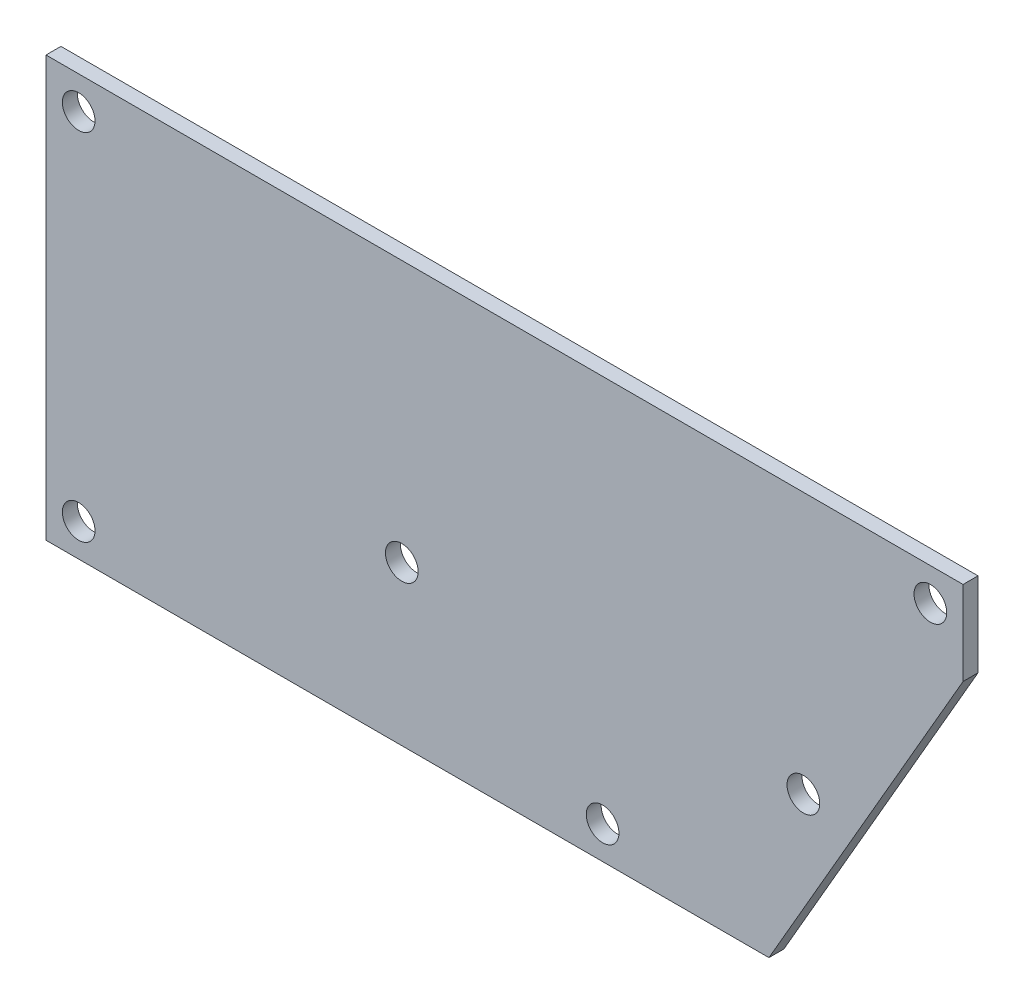
ISO-10303-21;
HEADER;
FILE_DESCRIPTION(('STEP AP214'),'2;1');
FILE_NAME('part.step','',(''),(''),'','','');
FILE_SCHEMA(('AUTOMOTIVE_DESIGN { 1 0 10303 214 1 1 1 1 }'));
ENDSEC;
DATA;
#1=APPLICATION_CONTEXT('core data for automotive mechanical design processes');
#2=APPLICATION_PROTOCOL_DEFINITION('international standard','automotive_design',2000,#1);
#3=PRODUCT_CONTEXT('',#1,'mechanical');
#4=PRODUCT('Part','Part','',(#3));
#5=PRODUCT_RELATED_PRODUCT_CATEGORY('part','',(#4));
#6=PRODUCT_DEFINITION_FORMATION('','',#4);
#7=PRODUCT_DEFINITION_CONTEXT('part definition',#1,'design');
#8=PRODUCT_DEFINITION('design','',#6,#7);
#9=PRODUCT_DEFINITION_SHAPE('','',#8);
#10=(LENGTH_UNIT() NAMED_UNIT(*) SI_UNIT(.MILLI.,.METRE.));
#11=(NAMED_UNIT(*) PLANE_ANGLE_UNIT() SI_UNIT($,.RADIAN.));
#12=(NAMED_UNIT(*) SI_UNIT($,.STERADIAN.) SOLID_ANGLE_UNIT());
#13=UNCERTAINTY_MEASURE_WITH_UNIT(LENGTH_MEASURE(1.E-05),#10,'distance_accuracy_value','');
#14=(GEOMETRIC_REPRESENTATION_CONTEXT(3) GLOBAL_UNCERTAINTY_ASSIGNED_CONTEXT((#13)) GLOBAL_UNIT_ASSIGNED_CONTEXT((#10,
#11,#12)) REPRESENTATION_CONTEXT('',''));
#15=CARTESIAN_POINT('',(0.,0.,0.));
#16=DIRECTION('',(0.,0.,1.));
#17=DIRECTION('',(1.,0.,0.));
#18=AXIS2_PLACEMENT_3D('',#15,#16,#17);
#19=CARTESIAN_POINT('',(0.,0.,1.6));
#20=DIRECTION('',(0.,0.,-1.));
#21=DIRECTION('',(-1.,0.,0.));
#22=AXIS2_PLACEMENT_3D('',#19,#20,#21);
#23=PLANE('',#22);
#24=DIRECTION('',(-1.,0.,0.));
#25=VECTOR('',#24,1.);
#26=CARTESIAN_POINT('',(-49.0980000000001,21.,1.6));
#27=LINE('',#26,#25);
#28=CARTESIAN_POINT('',(49.0980000000001,21.,1.6));
#29=VERTEX_POINT('',#28);
#30=CARTESIAN_POINT('',(-49.0980000000001,21.,1.6));
#31=VERTEX_POINT('',#30);
#32=EDGE_CURVE('E117',#29,#31,#27,.T.);
#33=ORIENTED_EDGE('',*,*,#32,.T.);
#34=DIRECTION('',(0.,-1.,0.));
#35=VECTOR('',#34,1.);
#36=CARTESIAN_POINT('',(-49.0980000000001,15.,1.6));
#37=LINE('',#36,#35);
#38=CARTESIAN_POINT('',(-49.0980000000001,-24.,1.6));
#39=VERTEX_POINT('',#38);
#40=EDGE_CURVE('E84',#31,#39,#37,.T.);
#41=ORIENTED_EDGE('',*,*,#40,.T.);
#42=DIRECTION('',(1.,0.,0.));
#43=VECTOR('',#42,1.);
#44=CARTESIAN_POINT('',(-49.0980000000001,-24.,1.6));
#45=LINE('',#44,#43);
#46=CARTESIAN_POINT('',(28.3133903091733,-24.,1.6));
#47=VERTEX_POINT('',#46);
#48=EDGE_CURVE('E88',#39,#47,#45,.T.);
#49=ORIENTED_EDGE('',*,*,#48,.T.);
#50=DIRECTION('',(0.500000000000004,0.866025403784436,0.));
#51=VECTOR('',#50,1.);
#52=CARTESIAN_POINT('',(49.0980000000001,12.,1.6));
#53=LINE('',#52,#51);
#54=CARTESIAN_POINT('',(49.0980000000001,12.,1.6));
#55=VERTEX_POINT('',#54);
#56=EDGE_CURVE('E92',#47,#55,#53,.T.);
#57=ORIENTED_EDGE('',*,*,#56,.T.);
#58=DIRECTION('',(0.,1.,0.));
#59=VECTOR('',#58,1.);
#60=CARTESIAN_POINT('',(49.0980000000001,21.,1.6));
#61=LINE('',#60,#59);
#62=EDGE_CURVE('E50',#55,#29,#61,.T.);
#63=ORIENTED_EDGE('',*,*,#62,.T.);
#64=EDGE_LOOP('',(#33,#41,#49,#57,#63));
#65=FACE_BOUND('',#64,.T.);
#66=CARTESIAN_POINT('',(10.5,-20.5,1.6));
#67=DIRECTION('',(0.,0.,1.));
#68=DIRECTION('',(1.,0.,0.));
#69=AXIS2_PLACEMENT_3D('',#66,#67,#68);
#70=CIRCLE('',#69,1.75);
#71=CARTESIAN_POINT('',(12.25,-20.5,1.6));
#72=VERTEX_POINT('',#71);
#73=EDGE_CURVE('E112',#72,#72,#70,.T.);
#74=ORIENTED_EDGE('',*,*,#73,.F.);
#75=EDGE_LOOP('',(#74));
#76=FACE_BOUND('',#75,.T.);
#77=CARTESIAN_POINT('',(32.,-7.,1.6));
#78=DIRECTION('',(0.,0.,1.));
#79=DIRECTION('',(1.,0.,0.));
#80=AXIS2_PLACEMENT_3D('',#77,#78,#79);
#81=CIRCLE('',#80,1.75000000000001);
#82=CARTESIAN_POINT('',(33.75,-7.,1.6));
#83=VERTEX_POINT('',#82);
#84=EDGE_CURVE('E196',#83,#83,#81,.T.);
#85=ORIENTED_EDGE('',*,*,#84,.F.);
#86=EDGE_LOOP('',(#85));
#87=FACE_BOUND('',#86,.T.);
#88=CARTESIAN_POINT('',(-11.,-7.,1.6));
#89=DIRECTION('',(0.,0.,1.));
#90=DIRECTION('',(1.,0.,0.));
#91=AXIS2_PLACEMENT_3D('',#88,#89,#90);
#92=CIRCLE('',#91,1.75);
#93=CARTESIAN_POINT('',(-9.25,-7.,1.6));
#94=VERTEX_POINT('',#93);
#95=EDGE_CURVE('E190',#94,#94,#92,.T.);
#96=ORIENTED_EDGE('',*,*,#95,.F.);
#97=EDGE_LOOP('',(#96));
#98=FACE_BOUND('',#97,.T.);
#99=CARTESIAN_POINT('',(45.5980000000001,17.5,1.6));
#100=DIRECTION('',(0.,0.,1.));
#101=DIRECTION('',(1.,0.,0.));
#102=AXIS2_PLACEMENT_3D('',#99,#100,#101);
#103=CIRCLE('',#102,1.75);
#104=CARTESIAN_POINT('',(47.3480000000001,17.5,1.6));
#105=VERTEX_POINT('',#104);
#106=EDGE_CURVE('E184',#105,#105,#103,.T.);
#107=ORIENTED_EDGE('',*,*,#106,.F.);
#108=EDGE_LOOP('',(#107));
#109=FACE_BOUND('',#108,.T.);
#110=CARTESIAN_POINT('',(-45.5980000000001,17.5,1.6));
#111=DIRECTION('',(0.,0.,1.));
#112=DIRECTION('',(1.,0.,0.));
#113=AXIS2_PLACEMENT_3D('',#110,#111,#112);
#114=CIRCLE('',#113,1.75);
#115=CARTESIAN_POINT('',(-43.8480000000001,17.5,1.6));
#116=VERTEX_POINT('',#115);
#117=EDGE_CURVE('E178',#116,#116,#114,.T.);
#118=ORIENTED_EDGE('',*,*,#117,.F.);
#119=EDGE_LOOP('',(#118));
#120=FACE_BOUND('',#119,.T.);
#121=CARTESIAN_POINT('',(-45.5980000000001,-20.5,1.6));
#122=DIRECTION('',(0.,0.,1.));
#123=DIRECTION('',(1.,0.,0.));
#124=AXIS2_PLACEMENT_3D('',#121,#122,#123);
#125=CIRCLE('',#124,1.75);
#126=CARTESIAN_POINT('',(-43.8480000000001,-20.5,1.6));
#127=VERTEX_POINT('',#126);
#128=EDGE_CURVE('E169',#127,#127,#125,.T.);
#129=ORIENTED_EDGE('',*,*,#128,.F.);
#130=EDGE_LOOP('',(#129));
#131=FACE_BOUND('',#130,.T.);
#132=ADVANCED_FACE('F33',(#65,#76,#87,#98,#109,#120,#131),#23,.F.);
#133=CARTESIAN_POINT('',(0.,0.,0.));
#134=DIRECTION('',(0.,0.,-1.));
#135=DIRECTION('',(-1.,0.,0.));
#136=AXIS2_PLACEMENT_3D('',#133,#134,#135);
#137=PLANE('',#136);
#138=CARTESIAN_POINT('',(-45.5980000000001,17.5,0.));
#139=DIRECTION('',(0.,0.,1.));
#140=DIRECTION('',(1.,0.,0.));
#141=AXIS2_PLACEMENT_3D('',#138,#139,#140);
#142=CIRCLE('',#141,1.75);
#143=CARTESIAN_POINT('',(-43.8480000000001,17.5,0.));
#144=VERTEX_POINT('',#143);
#145=EDGE_CURVE('E175',#144,#144,#142,.T.);
#146=ORIENTED_EDGE('',*,*,#145,.T.);
#147=EDGE_LOOP('',(#146));
#148=FACE_BOUND('',#147,.T.);
#149=CARTESIAN_POINT('',(-11.,-7.,0.));
#150=DIRECTION('',(0.,0.,1.));
#151=DIRECTION('',(1.,0.,0.));
#152=AXIS2_PLACEMENT_3D('',#149,#150,#151);
#153=CIRCLE('',#152,1.75);
#154=CARTESIAN_POINT('',(-9.25,-7.,0.));
#155=VERTEX_POINT('',#154);
#156=EDGE_CURVE('E187',#155,#155,#153,.T.);
#157=ORIENTED_EDGE('',*,*,#156,.T.);
#158=EDGE_LOOP('',(#157));
#159=FACE_BOUND('',#158,.T.);
#160=CARTESIAN_POINT('',(10.5,-20.5,0.));
#161=DIRECTION('',(0.,0.,1.));
#162=DIRECTION('',(1.,0.,0.));
#163=AXIS2_PLACEMENT_3D('',#160,#161,#162);
#164=CIRCLE('',#163,1.75);
#165=CARTESIAN_POINT('',(12.25,-20.5,0.));
#166=VERTEX_POINT('',#165);
#167=EDGE_CURVE('E199',#166,#166,#164,.T.);
#168=ORIENTED_EDGE('',*,*,#167,.T.);
#169=EDGE_LOOP('',(#168));
#170=FACE_BOUND('',#169,.T.);
#171=DIRECTION('',(-1.,0.,0.));
#172=VECTOR('',#171,1.);
#173=CARTESIAN_POINT('',(-49.0980000000001,21.,0.));
#174=LINE('',#173,#172);
#175=CARTESIAN_POINT('',(49.0980000000001,21.,0.));
#176=VERTEX_POINT('',#175);
#177=CARTESIAN_POINT('',(-49.0980000000001,21.,0.));
#178=VERTEX_POINT('',#177);
#179=EDGE_CURVE('E108',#176,#178,#174,.T.);
#180=ORIENTED_EDGE('',*,*,#179,.F.);
#181=DIRECTION('',(0.,1.,0.));
#182=VECTOR('',#181,1.);
#183=CARTESIAN_POINT('',(49.0980000000001,21.,0.));
#184=LINE('',#183,#182);
#185=CARTESIAN_POINT('',(49.0980000000001,12.,0.));
#186=VERTEX_POINT('',#185);
#187=EDGE_CURVE('E76',#186,#176,#184,.T.);
#188=ORIENTED_EDGE('',*,*,#187,.F.);
#189=DIRECTION('',(0.500000000000004,0.866025403784436,0.));
#190=VECTOR('',#189,1.);
#191=CARTESIAN_POINT('',(49.0980000000001,12.,0.));
#192=LINE('',#191,#190);
#193=CARTESIAN_POINT('',(28.3133903091733,-24.,0.));
#194=VERTEX_POINT('',#193);
#195=EDGE_CURVE('E70',#194,#186,#192,.T.);
#196=ORIENTED_EDGE('',*,*,#195,.F.);
#197=DIRECTION('',(1.,0.,0.));
#198=VECTOR('',#197,1.);
#199=CARTESIAN_POINT('',(-49.0980000000001,-24.,0.));
#200=LINE('',#199,#198);
#201=CARTESIAN_POINT('',(-49.0980000000001,-24.,0.));
#202=VERTEX_POINT('',#201);
#203=EDGE_CURVE('E99',#202,#194,#200,.T.);
#204=ORIENTED_EDGE('',*,*,#203,.F.);
#205=DIRECTION('',(0.,-1.,0.));
#206=VECTOR('',#205,1.);
#207=CARTESIAN_POINT('',(-49.0980000000001,15.,0.));
#208=LINE('',#207,#206);
#209=EDGE_CURVE('E111',#178,#202,#208,.T.);
#210=ORIENTED_EDGE('',*,*,#209,.F.);
#211=EDGE_LOOP('',(#180,#188,#196,#204,#210));
#212=FACE_BOUND('',#211,.T.);
#213=CARTESIAN_POINT('',(32.,-7.,0.));
#214=DIRECTION('',(0.,0.,1.));
#215=DIRECTION('',(1.,0.,0.));
#216=AXIS2_PLACEMENT_3D('',#213,#214,#215);
#217=CIRCLE('',#216,1.75000000000001);
#218=CARTESIAN_POINT('',(33.75,-7.,0.));
#219=VERTEX_POINT('',#218);
#220=EDGE_CURVE('E193',#219,#219,#217,.T.);
#221=ORIENTED_EDGE('',*,*,#220,.T.);
#222=EDGE_LOOP('',(#221));
#223=FACE_BOUND('',#222,.T.);
#224=CARTESIAN_POINT('',(45.5980000000001,17.5,0.));
#225=DIRECTION('',(0.,0.,1.));
#226=DIRECTION('',(1.,0.,0.));
#227=AXIS2_PLACEMENT_3D('',#224,#225,#226);
#228=CIRCLE('',#227,1.75);
#229=CARTESIAN_POINT('',(47.3480000000001,17.5,0.));
#230=VERTEX_POINT('',#229);
#231=EDGE_CURVE('E181',#230,#230,#228,.T.);
#232=ORIENTED_EDGE('',*,*,#231,.T.);
#233=EDGE_LOOP('',(#232));
#234=FACE_BOUND('',#233,.T.);
#235=CARTESIAN_POINT('',(-45.5980000000001,-20.5,0.));
#236=DIRECTION('',(0.,0.,1.));
#237=DIRECTION('',(1.,0.,0.));
#238=AXIS2_PLACEMENT_3D('',#235,#236,#237);
#239=CIRCLE('',#238,1.75);
#240=CARTESIAN_POINT('',(-43.8480000000001,-20.5,0.));
#241=VERTEX_POINT('',#240);
#242=EDGE_CURVE('E172',#241,#241,#239,.T.);
#243=ORIENTED_EDGE('',*,*,#242,.T.);
#244=EDGE_LOOP('',(#243));
#245=FACE_BOUND('',#244,.T.);
#246=ADVANCED_FACE('F121',(#148,#159,#170,#212,#223,#234,#245),#137,.T.);
#247=CARTESIAN_POINT('',(-49.0980000000001,21.,1.6));
#248=DIRECTION('',(0.,-1.,0.));
#249=DIRECTION('',(1.,0.,0.));
#250=AXIS2_PLACEMENT_3D('',#247,#248,#249);
#251=PLANE('',#250);
#252=ORIENTED_EDGE('',*,*,#179,.T.);
#253=DIRECTION('',(0.,0.,-1.));
#254=VECTOR('',#253,1.);
#255=CARTESIAN_POINT('',(-49.0980000000001,21.,1.6));
#256=LINE('',#255,#254);
#257=EDGE_CURVE('E11',#31,#178,#256,.T.);
#258=ORIENTED_EDGE('',*,*,#257,.F.);
#259=ORIENTED_EDGE('',*,*,#32,.F.);
#260=DIRECTION('',(0.,0.,-1.));
#261=VECTOR('',#260,1.);
#262=CARTESIAN_POINT('',(49.0980000000001,21.,1.6));
#263=LINE('',#262,#261);
#264=EDGE_CURVE('E104',#29,#176,#263,.T.);
#265=ORIENTED_EDGE('',*,*,#264,.T.);
#266=EDGE_LOOP('',(#252,#258,#259,#265));
#267=FACE_BOUND('',#266,.T.);
#268=ADVANCED_FACE('F35',(#267),#251,.F.);
#269=CARTESIAN_POINT('',(-49.0980000000001,15.,1.6));
#270=DIRECTION('',(1.,0.,0.));
#271=DIRECTION('',(0.,1.,0.));
#272=AXIS2_PLACEMENT_3D('',#269,#270,#271);
#273=PLANE('',#272);
#274=ORIENTED_EDGE('',*,*,#209,.T.);
#275=DIRECTION('',(0.,0.,-1.));
#276=VECTOR('',#275,1.);
#277=CARTESIAN_POINT('',(-49.0980000000001,-24.,1.6));
#278=LINE('',#277,#276);
#279=EDGE_CURVE('E42',#39,#202,#278,.T.);
#280=ORIENTED_EDGE('',*,*,#279,.F.);
#281=ORIENTED_EDGE('',*,*,#40,.F.);
#282=ORIENTED_EDGE('',*,*,#257,.T.);
#283=EDGE_LOOP('',(#274,#280,#281,#282));
#284=FACE_BOUND('',#283,.T.);
#285=ADVANCED_FACE('F268',(#284),#273,.F.);
#286=CARTESIAN_POINT('',(-49.0980000000001,-24.,1.6));
#287=DIRECTION('',(0.,1.,0.));
#288=DIRECTION('',(0.,0.,1.));
#289=AXIS2_PLACEMENT_3D('',#286,#287,#288);
#290=PLANE('',#289);
#291=ORIENTED_EDGE('',*,*,#203,.T.);
#292=DIRECTION('',(0.,0.,-1.));
#293=VECTOR('',#292,1.);
#294=CARTESIAN_POINT('',(28.3133903091733,-24.,1.6));
#295=LINE('',#294,#293);
#296=EDGE_CURVE('E96',#47,#194,#295,.T.);
#297=ORIENTED_EDGE('',*,*,#296,.F.);
#298=ORIENTED_EDGE('',*,*,#48,.F.);
#299=ORIENTED_EDGE('',*,*,#279,.T.);
#300=EDGE_LOOP('',(#291,#297,#298,#299));
#301=FACE_BOUND('',#300,.T.);
#302=ADVANCED_FACE('F97',(#301),#290,.F.);
#303=CARTESIAN_POINT('',(49.0980000000001,12.,1.6));
#304=DIRECTION('',(-0.866025403784436,0.500000000000004,0.));
#305=DIRECTION('',(-0.500000000000004,-0.866025403784436,0.));
#306=AXIS2_PLACEMENT_3D('',#303,#304,#305);
#307=PLANE('',#306);
#308=ORIENTED_EDGE('',*,*,#195,.T.);
#309=DIRECTION('',(0.,0.,-1.));
#310=VECTOR('',#309,1.);
#311=CARTESIAN_POINT('',(49.0980000000001,12.,1.6));
#312=LINE('',#311,#310);
#313=EDGE_CURVE('E100',#55,#186,#312,.T.);
#314=ORIENTED_EDGE('',*,*,#313,.F.);
#315=ORIENTED_EDGE('',*,*,#56,.F.);
#316=ORIENTED_EDGE('',*,*,#296,.T.);
#317=EDGE_LOOP('',(#308,#314,#315,#316));
#318=FACE_BOUND('',#317,.T.);
#319=ADVANCED_FACE('F102',(#318),#307,.F.);
#320=CARTESIAN_POINT('',(49.0980000000001,21.,1.6));
#321=DIRECTION('',(-1.,0.,0.));
#322=DIRECTION('',(0.,0.,1.));
#323=AXIS2_PLACEMENT_3D('',#320,#321,#322);
#324=PLANE('',#323);
#325=ORIENTED_EDGE('',*,*,#187,.T.);
#326=ORIENTED_EDGE('',*,*,#264,.F.);
#327=ORIENTED_EDGE('',*,*,#62,.F.);
#328=ORIENTED_EDGE('',*,*,#313,.T.);
#329=EDGE_LOOP('',(#325,#326,#327,#328));
#330=FACE_BOUND('',#329,.T.);
#331=ADVANCED_FACE('F126',(#330),#324,.F.);
#332=CARTESIAN_POINT('',(10.5,-20.5,1.6));
#333=DIRECTION('',(0.,0.,-1.));
#334=DIRECTION('',(-1.,0.,0.));
#335=AXIS2_PLACEMENT_3D('',#332,#333,#334);
#336=CYLINDRICAL_SURFACE('',#335,1.75);
#337=ORIENTED_EDGE('',*,*,#73,.T.);
#338=EDGE_LOOP('',(#337));
#339=FACE_BOUND('',#338,.T.);
#340=ORIENTED_EDGE('',*,*,#167,.F.);
#341=EDGE_LOOP('',(#340));
#342=FACE_BOUND('',#341,.T.);
#343=ADVANCED_FACE('F128',(#339,#342),#336,.F.);
#344=CARTESIAN_POINT('',(32.,-7.,1.6));
#345=DIRECTION('',(0.,0.,-1.));
#346=DIRECTION('',(-1.,0.,0.));
#347=AXIS2_PLACEMENT_3D('',#344,#345,#346);
#348=CYLINDRICAL_SURFACE('',#347,1.75000000000001);
#349=ORIENTED_EDGE('',*,*,#84,.T.);
#350=EDGE_LOOP('',(#349));
#351=FACE_BOUND('',#350,.T.);
#352=ORIENTED_EDGE('',*,*,#220,.F.);
#353=EDGE_LOOP('',(#352));
#354=FACE_BOUND('',#353,.T.);
#355=ADVANCED_FACE('F134',(#351,#354),#348,.F.);
#356=CARTESIAN_POINT('',(-11.,-7.,1.6));
#357=DIRECTION('',(0.,0.,-1.));
#358=DIRECTION('',(-1.,0.,0.));
#359=AXIS2_PLACEMENT_3D('',#356,#357,#358);
#360=CYLINDRICAL_SURFACE('',#359,1.75);
#361=ORIENTED_EDGE('',*,*,#95,.T.);
#362=EDGE_LOOP('',(#361));
#363=FACE_BOUND('',#362,.T.);
#364=ORIENTED_EDGE('',*,*,#156,.F.);
#365=EDGE_LOOP('',(#364));
#366=FACE_BOUND('',#365,.T.);
#367=ADVANCED_FACE('F148',(#363,#366),#360,.F.);
#368=CARTESIAN_POINT('',(45.5980000000001,17.5,1.6));
#369=DIRECTION('',(0.,0.,-1.));
#370=DIRECTION('',(-1.,0.,0.));
#371=AXIS2_PLACEMENT_3D('',#368,#369,#370);
#372=CYLINDRICAL_SURFACE('',#371,1.75);
#373=ORIENTED_EDGE('',*,*,#106,.T.);
#374=EDGE_LOOP('',(#373));
#375=FACE_BOUND('',#374,.T.);
#376=ORIENTED_EDGE('',*,*,#231,.F.);
#377=EDGE_LOOP('',(#376));
#378=FACE_BOUND('',#377,.T.);
#379=ADVANCED_FACE('F152',(#375,#378),#372,.F.);
#380=CARTESIAN_POINT('',(-45.5980000000001,17.5,1.6));
#381=DIRECTION('',(0.,0.,-1.));
#382=DIRECTION('',(-1.,0.,0.));
#383=AXIS2_PLACEMENT_3D('',#380,#381,#382);
#384=CYLINDRICAL_SURFACE('',#383,1.75);
#385=ORIENTED_EDGE('',*,*,#117,.T.);
#386=EDGE_LOOP('',(#385));
#387=FACE_BOUND('',#386,.T.);
#388=ORIENTED_EDGE('',*,*,#145,.F.);
#389=EDGE_LOOP('',(#388));
#390=FACE_BOUND('',#389,.T.);
#391=ADVANCED_FACE('F156',(#387,#390),#384,.F.);
#392=CARTESIAN_POINT('',(-45.5980000000001,-20.5,1.6));
#393=DIRECTION('',(0.,0.,-1.));
#394=DIRECTION('',(-1.,0.,0.));
#395=AXIS2_PLACEMENT_3D('',#392,#393,#394);
#396=CYLINDRICAL_SURFACE('',#395,1.75);
#397=ORIENTED_EDGE('',*,*,#128,.T.);
#398=EDGE_LOOP('',(#397));
#399=FACE_BOUND('',#398,.T.);
#400=ORIENTED_EDGE('',*,*,#242,.F.);
#401=EDGE_LOOP('',(#400));
#402=FACE_BOUND('',#401,.T.);
#403=ADVANCED_FACE('F160',(#399,#402),#396,.F.);
#404=CLOSED_SHELL('',(#132,#246,#268,#285,#302,#319,#331,#343,#355,#367,#379,#391,#403));
#405=MANIFOLD_SOLID_BREP('B2',#404);
#406=ADVANCED_BREP_SHAPE_REPRESENTATION('',(#18,#405),#14);
#407=SHAPE_DEFINITION_REPRESENTATION(#9,#406);
ENDSEC;
END-ISO-10303-21;
